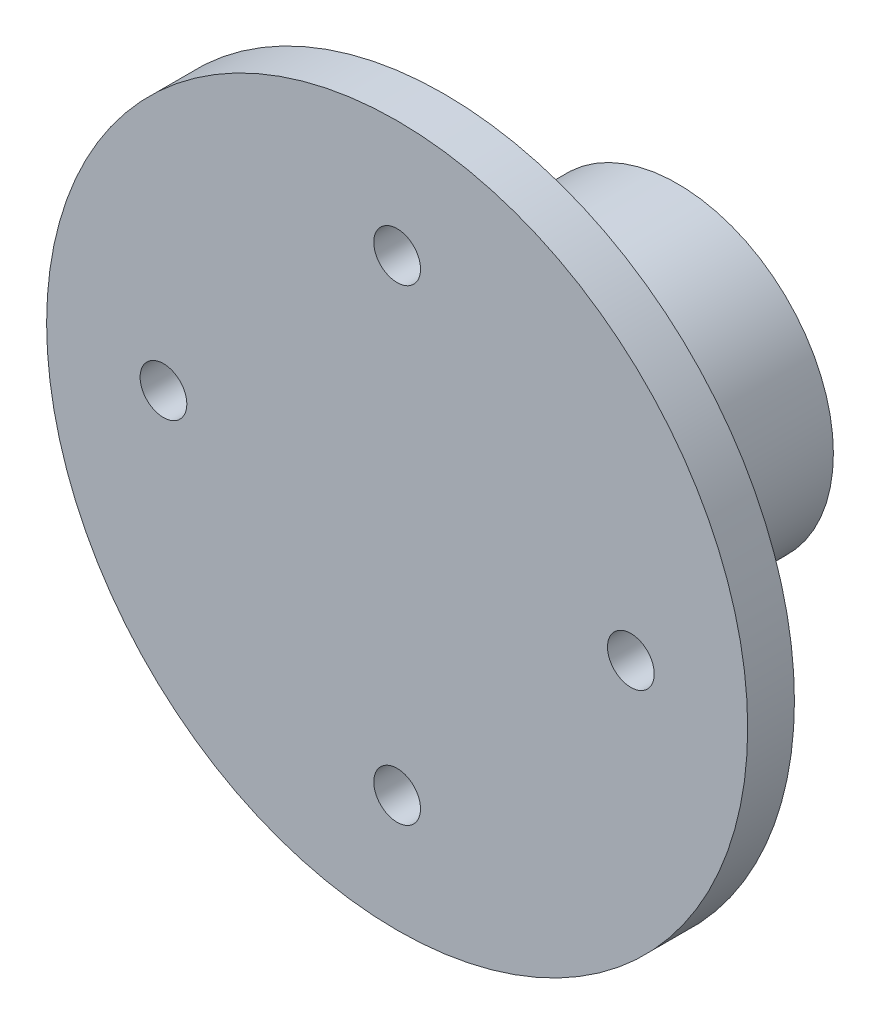
ISO-10303-21;
HEADER;
FILE_DESCRIPTION(('STEP AP214'),'2;1');
FILE_NAME('part.step','',(''),(''),'','','');
FILE_SCHEMA(('AUTOMOTIVE_DESIGN { 1 0 10303 214 1 1 1 1 }'));
ENDSEC;
DATA;
#1=APPLICATION_CONTEXT('core data for automotive mechanical design processes');
#2=APPLICATION_PROTOCOL_DEFINITION('international standard','automotive_design',2000,#1);
#3=PRODUCT_CONTEXT('',#1,'mechanical');
#4=PRODUCT('Part','Part','',(#3));
#5=PRODUCT_RELATED_PRODUCT_CATEGORY('part','',(#4));
#6=PRODUCT_DEFINITION_FORMATION('','',#4);
#7=PRODUCT_DEFINITION_CONTEXT('part definition',#1,'design');
#8=PRODUCT_DEFINITION('design','',#6,#7);
#9=PRODUCT_DEFINITION_SHAPE('','',#8);
#10=(LENGTH_UNIT() NAMED_UNIT(*) SI_UNIT(.MILLI.,.METRE.));
#11=(NAMED_UNIT(*) PLANE_ANGLE_UNIT() SI_UNIT($,.RADIAN.));
#12=(NAMED_UNIT(*) SI_UNIT($,.STERADIAN.) SOLID_ANGLE_UNIT());
#13=UNCERTAINTY_MEASURE_WITH_UNIT(LENGTH_MEASURE(1.E-05),#10,'distance_accuracy_value','');
#14=(GEOMETRIC_REPRESENTATION_CONTEXT(3) GLOBAL_UNCERTAINTY_ASSIGNED_CONTEXT((#13)) GLOBAL_UNIT_ASSIGNED_CONTEXT((#10,
#11,#12)) REPRESENTATION_CONTEXT('',''));
#15=CARTESIAN_POINT('',(0.,0.,0.));
#16=DIRECTION('',(0.,0.,1.));
#17=DIRECTION('',(1.,0.,0.));
#18=AXIS2_PLACEMENT_3D('',#15,#16,#17);
#19=CARTESIAN_POINT('',(0.,10.,3.));
#20=DIRECTION('',(0.,0.,-1.));
#21=DIRECTION('',(-1.,0.,0.));
#22=AXIS2_PLACEMENT_3D('',#19,#20,#21);
#23=CYLINDRICAL_SURFACE('',#22,22.5);
#24=CARTESIAN_POINT('',(0.,10.,3.));
#25=DIRECTION('',(0.,0.,1.));
#26=DIRECTION('',(1.,0.,0.));
#27=AXIS2_PLACEMENT_3D('',#24,#25,#26);
#28=CIRCLE('',#27,22.5);
#29=CARTESIAN_POINT('',(22.5,10.,3.));
#30=VERTEX_POINT('',#29);
#31=EDGE_CURVE('E56',#30,#30,#28,.T.);
#32=ORIENTED_EDGE('',*,*,#31,.F.);
#33=EDGE_LOOP('',(#32));
#34=FACE_BOUND('',#33,.T.);
#35=CARTESIAN_POINT('',(0.,10.,0.));
#36=DIRECTION('',(0.,0.,1.));
#37=DIRECTION('',(1.,0.,0.));
#38=AXIS2_PLACEMENT_3D('',#35,#36,#37);
#39=CIRCLE('',#38,22.5);
#40=CARTESIAN_POINT('',(22.5,10.,0.));
#41=VERTEX_POINT('',#40);
#42=EDGE_CURVE('E61',#41,#41,#39,.T.);
#43=ORIENTED_EDGE('',*,*,#42,.T.);
#44=EDGE_LOOP('',(#43));
#45=FACE_BOUND('',#44,.T.);
#46=ADVANCED_FACE('F49',(#34,#45),#23,.T.);
#47=CARTESIAN_POINT('',(0.,10.,3.));
#48=DIRECTION('',(0.,0.,1.));
#49=DIRECTION('',(1.,0.,0.));
#50=AXIS2_PLACEMENT_3D('',#47,#48,#49);
#51=PLANE('',#50);
#52=CARTESIAN_POINT('',(-14.9999999999992,9.99999999999931,3.));
#53=DIRECTION('',(0.,0.,1.));
#54=DIRECTION('',(1.,0.,0.));
#55=AXIS2_PLACEMENT_3D('',#52,#53,#54);
#56=CIRCLE('',#55,1.5);
#57=CARTESIAN_POINT('',(-13.4999999999992,9.99999999999931,3.));
#58=VERTEX_POINT('',#57);
#59=EDGE_CURVE('E77',#58,#58,#56,.F.);
#60=ORIENTED_EDGE('',*,*,#59,.T.);
#61=EDGE_LOOP('',(#60));
#62=FACE_BOUND('',#61,.T.);
#63=CARTESIAN_POINT('',(1.59321024486406E-12,-5.,3.));
#64=DIRECTION('',(0.,0.,1.));
#65=DIRECTION('',(1.,0.,0.));
#66=AXIS2_PLACEMENT_3D('',#63,#64,#65);
#67=CIRCLE('',#66,1.5);
#68=CARTESIAN_POINT('',(1.50000000000159,-5.,3.));
#69=VERTEX_POINT('',#68);
#70=EDGE_CURVE('E84',#69,#69,#67,.F.);
#71=ORIENTED_EDGE('',*,*,#70,.T.);
#72=EDGE_LOOP('',(#71));
#73=FACE_BOUND('',#72,.T.);
#74=CARTESIAN_POINT('',(15.0000000000008,10.0000000000008,3.));
#75=DIRECTION('',(0.,0.,1.));
#76=DIRECTION('',(1.,0.,0.));
#77=AXIS2_PLACEMENT_3D('',#74,#75,#76);
#78=CIRCLE('',#77,1.5);
#79=CARTESIAN_POINT('',(16.5000000000008,10.0000000000008,3.));
#80=VERTEX_POINT('',#79);
#81=EDGE_CURVE('E88',#80,#80,#78,.F.);
#82=ORIENTED_EDGE('',*,*,#81,.T.);
#83=EDGE_LOOP('',(#82));
#84=FACE_BOUND('',#83,.T.);
#85=CARTESIAN_POINT('',(0.,25.,3.));
#86=DIRECTION('',(0.,0.,1.));
#87=DIRECTION('',(1.,0.,0.));
#88=AXIS2_PLACEMENT_3D('',#85,#86,#87);
#89=CIRCLE('',#88,1.5);
#90=CARTESIAN_POINT('',(1.5,25.,3.));
#91=VERTEX_POINT('',#90);
#92=EDGE_CURVE('E92',#91,#91,#89,.F.);
#93=ORIENTED_EDGE('',*,*,#92,.T.);
#94=EDGE_LOOP('',(#93));
#95=FACE_BOUND('',#94,.T.);
#96=ORIENTED_EDGE('',*,*,#31,.T.);
#97=EDGE_LOOP('',(#96));
#98=FACE_BOUND('',#97,.T.);
#99=ADVANCED_FACE('F129',(#62,#73,#84,#95,#98),#51,.T.);
#100=CARTESIAN_POINT('',(0.,10.,0.));
#101=DIRECTION('',(0.,0.,1.));
#102=DIRECTION('',(1.,0.,0.));
#103=AXIS2_PLACEMENT_3D('',#100,#101,#102);
#104=PLANE('',#103);
#105=CARTESIAN_POINT('',(-14.9999999999992,9.99999999999931,0.));
#106=DIRECTION('',(0.,0.,1.));
#107=DIRECTION('',(1.,0.,0.));
#108=AXIS2_PLACEMENT_3D('',#105,#106,#107);
#109=CIRCLE('',#108,1.5);
#110=CARTESIAN_POINT('',(-13.4999999999992,9.99999999999931,0.));
#111=VERTEX_POINT('',#110);
#112=EDGE_CURVE('E96',#111,#111,#109,.T.);
#113=ORIENTED_EDGE('',*,*,#112,.T.);
#114=EDGE_LOOP('',(#113));
#115=FACE_BOUND('',#114,.T.);
#116=CARTESIAN_POINT('',(1.59321024486406E-12,-5.,0.));
#117=DIRECTION('',(0.,0.,1.));
#118=DIRECTION('',(1.,0.,0.));
#119=AXIS2_PLACEMENT_3D('',#116,#117,#118);
#120=CIRCLE('',#119,1.5);
#121=CARTESIAN_POINT('',(1.50000000000159,-5.,0.));
#122=VERTEX_POINT('',#121);
#123=EDGE_CURVE('E105',#122,#122,#120,.T.);
#124=ORIENTED_EDGE('',*,*,#123,.T.);
#125=EDGE_LOOP('',(#124));
#126=FACE_BOUND('',#125,.T.);
#127=CARTESIAN_POINT('',(15.0000000000008,10.0000000000008,0.));
#128=DIRECTION('',(0.,0.,1.));
#129=DIRECTION('',(1.,0.,0.));
#130=AXIS2_PLACEMENT_3D('',#127,#128,#129);
#131=CIRCLE('',#130,1.5);
#132=CARTESIAN_POINT('',(16.5000000000008,10.0000000000008,0.));
#133=VERTEX_POINT('',#132);
#134=EDGE_CURVE('E101',#133,#133,#131,.T.);
#135=ORIENTED_EDGE('',*,*,#134,.T.);
#136=EDGE_LOOP('',(#135));
#137=FACE_BOUND('',#136,.T.);
#138=CARTESIAN_POINT('',(0.,25.,0.));
#139=DIRECTION('',(0.,0.,1.));
#140=DIRECTION('',(1.,0.,0.));
#141=AXIS2_PLACEMENT_3D('',#138,#139,#140);
#142=CIRCLE('',#141,1.5);
#143=CARTESIAN_POINT('',(1.5,25.,0.));
#144=VERTEX_POINT('',#143);
#145=EDGE_CURVE('E97',#144,#144,#142,.T.);
#146=ORIENTED_EDGE('',*,*,#145,.T.);
#147=EDGE_LOOP('',(#146));
#148=FACE_BOUND('',#147,.T.);
#149=CARTESIAN_POINT('',(0.,10.,0.));
#150=DIRECTION('',(0.,0.,1.));
#151=DIRECTION('',(1.,0.,0.));
#152=AXIS2_PLACEMENT_3D('',#149,#150,#151);
#153=CIRCLE('',#152,10.);
#154=CARTESIAN_POINT('',(10.,10.,0.));
#155=VERTEX_POINT('',#154);
#156=EDGE_CURVE('E11',#155,#155,#153,.F.);
#157=ORIENTED_EDGE('',*,*,#156,.F.);
#158=EDGE_LOOP('',(#157));
#159=FACE_BOUND('',#158,.T.);
#160=ORIENTED_EDGE('',*,*,#42,.F.);
#161=EDGE_LOOP('',(#160));
#162=FACE_BOUND('',#161,.T.);
#163=ADVANCED_FACE('F113',(#115,#126,#137,#148,#159,#162),#104,.F.);
#164=CARTESIAN_POINT('',(0.,10.,-15.));
#165=DIRECTION('',(0.,0.,-1.));
#166=DIRECTION('',(-1.,0.,0.));
#167=AXIS2_PLACEMENT_3D('',#164,#165,#166);
#168=PLANE('',#167);
#169=CARTESIAN_POINT('',(0.,10.,-15.));
#170=DIRECTION('',(0.,0.,-1.));
#171=DIRECTION('',(-1.,0.,0.));
#172=AXIS2_PLACEMENT_3D('',#169,#170,#171);
#173=CIRCLE('',#172,10.);
#174=CARTESIAN_POINT('',(-10.,10.,-15.));
#175=VERTEX_POINT('',#174);
#176=EDGE_CURVE('E67',#175,#175,#173,.T.);
#177=ORIENTED_EDGE('',*,*,#176,.T.);
#178=EDGE_LOOP('',(#177));
#179=FACE_BOUND('',#178,.T.);
#180=CARTESIAN_POINT('',(0.,10.,-15.));
#181=DIRECTION('',(0.,0.,-1.));
#182=DIRECTION('',(-1.,0.,0.));
#183=AXIS2_PLACEMENT_3D('',#180,#181,#182);
#184=CIRCLE('',#183,7.);
#185=CARTESIAN_POINT('',(-7.,10.,-15.));
#186=VERTEX_POINT('',#185);
#187=EDGE_CURVE('E72',#186,#186,#184,.T.);
#188=ORIENTED_EDGE('',*,*,#187,.F.);
#189=EDGE_LOOP('',(#188));
#190=FACE_BOUND('',#189,.T.);
#191=ADVANCED_FACE('F141',(#179,#190),#168,.T.);
#192=CARTESIAN_POINT('',(0.,10.,-15.));
#193=DIRECTION('',(0.,0.,1.));
#194=DIRECTION('',(1.,0.,0.));
#195=AXIS2_PLACEMENT_3D('',#192,#193,#194);
#196=CYLINDRICAL_SURFACE('',#195,10.);
#197=ORIENTED_EDGE('',*,*,#176,.F.);
#198=EDGE_LOOP('',(#197));
#199=FACE_BOUND('',#198,.T.);
#200=ORIENTED_EDGE('',*,*,#156,.T.);
#201=EDGE_LOOP('',(#200));
#202=FACE_BOUND('',#201,.T.);
#203=ADVANCED_FACE('F146',(#199,#202),#196,.T.);
#204=CARTESIAN_POINT('',(0.,10.,-15.));
#205=DIRECTION('',(0.,0.,1.));
#206=DIRECTION('',(1.,0.,0.));
#207=AXIS2_PLACEMENT_3D('',#204,#205,#206);
#208=CYLINDRICAL_SURFACE('',#207,7.);
#209=ORIENTED_EDGE('',*,*,#187,.T.);
#210=EDGE_LOOP('',(#209));
#211=FACE_BOUND('',#210,.T.);
#212=CARTESIAN_POINT('',(0.,10.,0.));
#213=DIRECTION('',(0.,0.,-1.));
#214=DIRECTION('',(-1.,0.,0.));
#215=AXIS2_PLACEMENT_3D('',#212,#213,#214);
#216=CIRCLE('',#215,7.);
#217=CARTESIAN_POINT('',(-7.,10.,0.));
#218=VERTEX_POINT('',#217);
#219=EDGE_CURVE('E73',#218,#218,#216,.T.);
#220=ORIENTED_EDGE('',*,*,#219,.F.);
#221=EDGE_LOOP('',(#220));
#222=FACE_BOUND('',#221,.T.);
#223=ADVANCED_FACE('F151',(#211,#222),#208,.F.);
#224=ORIENTED_EDGE('',*,*,#219,.T.);
#225=EDGE_LOOP('',(#224));
#226=FACE_BOUND('',#225,.T.);
#227=ADVANCED_FACE('F142',(#226),#104,.F.);
#228=CARTESIAN_POINT('',(0.,25.,9.));
#229=DIRECTION('',(0.,0.,-1.));
#230=DIRECTION('',(-1.,0.,0.));
#231=AXIS2_PLACEMENT_3D('',#228,#229,#230);
#232=CYLINDRICAL_SURFACE('',#231,1.5);
#233=ORIENTED_EDGE('',*,*,#92,.F.);
#234=EDGE_LOOP('',(#233));
#235=FACE_BOUND('',#234,.T.);
#236=ORIENTED_EDGE('',*,*,#145,.F.);
#237=EDGE_LOOP('',(#236));
#238=FACE_BOUND('',#237,.T.);
#239=ADVANCED_FACE('F150',(#235,#238),#232,.F.);
#240=CARTESIAN_POINT('',(15.0000000000008,10.0000000000008,9.));
#241=DIRECTION('',(0.,0.,-1.));
#242=DIRECTION('',(-1.,0.,0.));
#243=AXIS2_PLACEMENT_3D('',#240,#241,#242);
#244=CYLINDRICAL_SURFACE('',#243,1.5);
#245=ORIENTED_EDGE('',*,*,#81,.F.);
#246=EDGE_LOOP('',(#245));
#247=FACE_BOUND('',#246,.T.);
#248=ORIENTED_EDGE('',*,*,#134,.F.);
#249=EDGE_LOOP('',(#248));
#250=FACE_BOUND('',#249,.T.);
#251=ADVANCED_FACE('F124',(#247,#250),#244,.F.);
#252=CARTESIAN_POINT('',(1.59321024486406E-12,-5.,9.));
#253=DIRECTION('',(0.,0.,-1.));
#254=DIRECTION('',(-1.,0.,0.));
#255=AXIS2_PLACEMENT_3D('',#252,#253,#254);
#256=CYLINDRICAL_SURFACE('',#255,1.5);
#257=ORIENTED_EDGE('',*,*,#70,.F.);
#258=EDGE_LOOP('',(#257));
#259=FACE_BOUND('',#258,.T.);
#260=ORIENTED_EDGE('',*,*,#123,.F.);
#261=EDGE_LOOP('',(#260));
#262=FACE_BOUND('',#261,.T.);
#263=ADVANCED_FACE('F118',(#259,#262),#256,.F.);
#264=CARTESIAN_POINT('',(-14.9999999999992,9.99999999999931,9.));
#265=DIRECTION('',(0.,0.,-1.));
#266=DIRECTION('',(-1.,0.,0.));
#267=AXIS2_PLACEMENT_3D('',#264,#265,#266);
#268=CYLINDRICAL_SURFACE('',#267,1.5);
#269=ORIENTED_EDGE('',*,*,#59,.F.);
#270=EDGE_LOOP('',(#269));
#271=FACE_BOUND('',#270,.T.);
#272=ORIENTED_EDGE('',*,*,#112,.F.);
#273=EDGE_LOOP('',(#272));
#274=FACE_BOUND('',#273,.T.);
#275=ADVANCED_FACE('F116',(#271,#274),#268,.F.);
#276=CLOSED_SHELL('',(#46,#99,#163,#191,#203,#223,#227,#239,#251,#263,#275));
#277=MANIFOLD_SOLID_BREP('B2',#276);
#278=ADVANCED_BREP_SHAPE_REPRESENTATION('',(#18,#277),#14);
#279=SHAPE_DEFINITION_REPRESENTATION(#9,#278);
ENDSEC;
END-ISO-10303-21;
